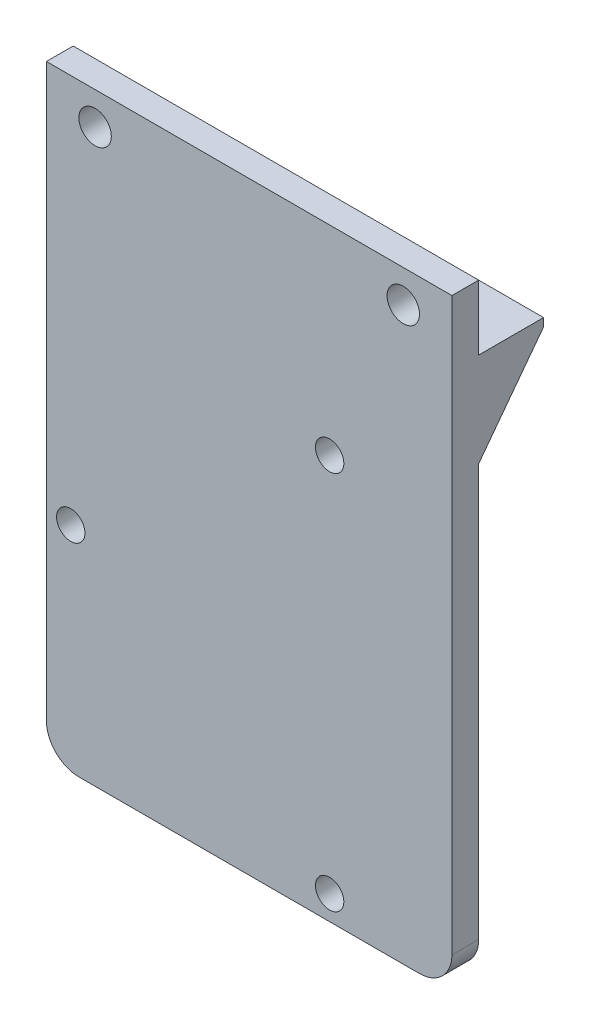
ISO-10303-21;
HEADER;
FILE_DESCRIPTION(('STEP AP214'),'2;1');
FILE_NAME('part.step','',(''),(''),'','','');
FILE_SCHEMA(('AUTOMOTIVE_DESIGN { 1 0 10303 214 1 1 1 1 }'));
ENDSEC;
DATA;
#1=APPLICATION_CONTEXT('core data for automotive mechanical design processes');
#2=APPLICATION_PROTOCOL_DEFINITION('international standard','automotive_design',2000,#1);
#3=PRODUCT_CONTEXT('',#1,'mechanical');
#4=PRODUCT('Part','Part','',(#3));
#5=PRODUCT_RELATED_PRODUCT_CATEGORY('part','',(#4));
#6=PRODUCT_DEFINITION_FORMATION('','',#4);
#7=PRODUCT_DEFINITION_CONTEXT('part definition',#1,'design');
#8=PRODUCT_DEFINITION('design','',#6,#7);
#9=PRODUCT_DEFINITION_SHAPE('','',#8);
#10=(LENGTH_UNIT() NAMED_UNIT(*) SI_UNIT(.MILLI.,.METRE.));
#11=(NAMED_UNIT(*) PLANE_ANGLE_UNIT() SI_UNIT($,.RADIAN.));
#12=(NAMED_UNIT(*) SI_UNIT($,.STERADIAN.) SOLID_ANGLE_UNIT());
#13=UNCERTAINTY_MEASURE_WITH_UNIT(LENGTH_MEASURE(1.E-05),#10,'distance_accuracy_value','');
#14=(GEOMETRIC_REPRESENTATION_CONTEXT(3) GLOBAL_UNCERTAINTY_ASSIGNED_CONTEXT((#13)) GLOBAL_UNIT_ASSIGNED_CONTEXT((#10,
#11,#12)) REPRESENTATION_CONTEXT('',''));
#15=CARTESIAN_POINT('',(0.,0.,0.));
#16=DIRECTION('',(0.,0.,1.));
#17=DIRECTION('',(1.,0.,0.));
#18=AXIS2_PLACEMENT_3D('',#15,#16,#17);
#19=CARTESIAN_POINT('',(0.,0.,0.));
#20=DIRECTION('',(0.,0.,1.));
#21=DIRECTION('',(1.,0.,0.));
#22=AXIS2_PLACEMENT_3D('',#19,#20,#21);
#23=PLANE('',#22);
#24=CARTESIAN_POINT('',(9.07999999999999,20.6,0.));
#25=DIRECTION('',(0.,0.,1.));
#26=DIRECTION('',(1.,0.,0.));
#27=AXIS2_PLACEMENT_3D('',#24,#25,#26);
#28=CIRCLE('',#27,2.);
#29=CARTESIAN_POINT('',(11.08,20.6,0.));
#30=VERTEX_POINT('',#29);
#31=EDGE_CURVE('E211',#30,#30,#28,.T.);
#32=ORIENTED_EDGE('',*,*,#31,.T.);
#33=EDGE_LOOP('',(#32));
#34=FACE_BOUND('',#33,.T.);
#35=CARTESIAN_POINT('',(-28.92,20.6,0.));
#36=DIRECTION('',(0.,0.,1.));
#37=DIRECTION('',(1.,0.,0.));
#38=AXIS2_PLACEMENT_3D('',#35,#36,#37);
#39=CIRCLE('',#38,2.);
#40=CARTESIAN_POINT('',(-26.92,20.6,0.));
#41=VERTEX_POINT('',#40);
#42=EDGE_CURVE('E170',#41,#41,#39,.T.);
#43=ORIENTED_EDGE('',*,*,#42,.T.);
#44=EDGE_LOOP('',(#43));
#45=FACE_BOUND('',#44,.T.);
#46=DIRECTION('',(1.,0.,0.));
#47=VECTOR('',#46,1.);
#48=CARTESIAN_POINT('',(-49.0111319630468,16.6,0.));
#49=LINE('',#48,#47);
#50=CARTESIAN_POINT('',(-34.92,16.6,0.));
#51=VERTEX_POINT('',#50);
#52=CARTESIAN_POINT('',(15.08,16.6,0.));
#53=VERTEX_POINT('',#52);
#54=EDGE_CURVE('E71',#51,#53,#49,.T.);
#55=ORIENTED_EDGE('',*,*,#54,.F.);
#56=DIRECTION('',(0.,-1.,0.));
#57=VECTOR('',#56,1.);
#58=CARTESIAN_POINT('',(-34.92,0.,0.));
#59=LINE('',#58,#57);
#60=CARTESIAN_POINT('',(-34.92,24.6,0.));
#61=VERTEX_POINT('',#60);
#62=EDGE_CURVE('E231',#61,#51,#59,.T.);
#63=ORIENTED_EDGE('',*,*,#62,.F.);
#64=DIRECTION('',(-1.,0.,0.));
#65=VECTOR('',#64,1.);
#66=CARTESIAN_POINT('',(0.,24.6,0.));
#67=LINE('',#66,#65);
#68=CARTESIAN_POINT('',(15.08,24.6,0.));
#69=VERTEX_POINT('',#68);
#70=EDGE_CURVE('E227',#69,#61,#67,.T.);
#71=ORIENTED_EDGE('',*,*,#70,.F.);
#72=DIRECTION('',(0.,-1.,0.));
#73=VECTOR('',#72,1.);
#74=CARTESIAN_POINT('',(15.08,0.,0.));
#75=LINE('',#74,#73);
#76=EDGE_CURVE('E176',#69,#53,#75,.T.);
#77=ORIENTED_EDGE('',*,*,#76,.T.);
#78=EDGE_LOOP('',(#55,#63,#71,#77));
#79=FACE_BOUND('',#78,.T.);
#80=ADVANCED_FACE('F47',(#34,#45,#79),#23,.F.);
#81=CARTESIAN_POINT('',(0.,24.6,3.3));
#82=DIRECTION('',(0.,-1.,0.));
#83=DIRECTION('',(1.,0.,0.));
#84=AXIS2_PLACEMENT_3D('',#81,#82,#83);
#85=PLANE('',#84);
#86=ORIENTED_EDGE('',*,*,#70,.T.);
#87=DIRECTION('',(0.,0.,-1.));
#88=VECTOR('',#87,1.);
#89=CARTESIAN_POINT('',(-34.92,24.6,3.3));
#90=LINE('',#89,#88);
#91=CARTESIAN_POINT('',(-34.92,24.6,3.3));
#92=VERTEX_POINT('',#91);
#93=EDGE_CURVE('E242',#92,#61,#90,.T.);
#94=ORIENTED_EDGE('',*,*,#93,.F.);
#95=DIRECTION('',(-1.,0.,0.));
#96=VECTOR('',#95,1.);
#97=CARTESIAN_POINT('',(0.,24.6,3.3));
#98=LINE('',#97,#96);
#99=CARTESIAN_POINT('',(15.08,24.6,3.3));
#100=VERTEX_POINT('',#99);
#101=EDGE_CURVE('E192',#100,#92,#98,.T.);
#102=ORIENTED_EDGE('',*,*,#101,.F.);
#103=DIRECTION('',(0.,0.,-1.));
#104=VECTOR('',#103,1.);
#105=CARTESIAN_POINT('',(15.08,24.6,3.3));
#106=LINE('',#105,#104);
#107=EDGE_CURVE('E207',#100,#69,#106,.T.);
#108=ORIENTED_EDGE('',*,*,#107,.T.);
#109=EDGE_LOOP('',(#86,#94,#102,#108));
#110=FACE_BOUND('',#109,.T.);
#111=ADVANCED_FACE('F289',(#110),#85,.F.);
#112=CARTESIAN_POINT('',(-34.92,0.,3.3));
#113=DIRECTION('',(1.,0.,0.));
#114=DIRECTION('',(0.,1.,0.));
#115=AXIS2_PLACEMENT_3D('',#112,#113,#114);
#116=PLANE('',#115);
#117=ORIENTED_EDGE('',*,*,#62,.T.);
#118=DIRECTION('',(0.,0.,-1.));
#119=VECTOR('',#118,1.);
#120=CARTESIAN_POINT('',(-34.92,16.6,0.));
#121=LINE('',#120,#119);
#122=CARTESIAN_POINT('',(-34.92,16.6,-8.));
#123=VERTEX_POINT('',#122);
#124=EDGE_CURVE('E156',#51,#123,#121,.T.);
#125=ORIENTED_EDGE('',*,*,#124,.T.);
#126=DIRECTION('',(0.,-1.,0.));
#127=VECTOR('',#126,1.);
#128=CARTESIAN_POINT('',(-34.92,16.6,-8.));
#129=LINE('',#128,#127);
#130=CARTESIAN_POINT('',(-34.92,15.6,-8.));
#131=VERTEX_POINT('',#130);
#132=EDGE_CURVE('E163',#123,#131,#129,.T.);
#133=ORIENTED_EDGE('',*,*,#132,.T.);
#134=DIRECTION('',(0.,-0.798189150333231,0.602406905911872));
#135=VECTOR('',#134,1.);
#136=CARTESIAN_POINT('',(-34.92,15.6,-8.));
#137=LINE('',#136,#135);
#138=CARTESIAN_POINT('',(-34.92,5.,0.));
#139=VERTEX_POINT('',#138);
#140=EDGE_CURVE('E131',#131,#139,#137,.T.);
#141=ORIENTED_EDGE('',*,*,#140,.T.);
#142=CARTESIAN_POINT('',(-34.92,-45.8,0.));
#143=VERTEX_POINT('',#142);
#144=EDGE_CURVE('E63',#139,#143,#59,.T.);
#145=ORIENTED_EDGE('',*,*,#144,.T.);
#146=DIRECTION('',(0.,0.,-1.));
#147=VECTOR('',#146,1.);
#148=CARTESIAN_POINT('',(-34.92,-45.8,3.3));
#149=LINE('',#148,#147);
#150=CARTESIAN_POINT('',(-34.92,-45.8,3.3));
#151=VERTEX_POINT('',#150);
#152=EDGE_CURVE('E11',#143,#151,#149,.F.);
#153=ORIENTED_EDGE('',*,*,#152,.T.);
#154=DIRECTION('',(0.,-1.,0.));
#155=VECTOR('',#154,1.);
#156=CARTESIAN_POINT('',(-34.92,0.,3.3));
#157=LINE('',#156,#155);
#158=EDGE_CURVE('E196',#92,#151,#157,.T.);
#159=ORIENTED_EDGE('',*,*,#158,.F.);
#160=ORIENTED_EDGE('',*,*,#93,.T.);
#161=EDGE_LOOP('',(#117,#125,#133,#141,#145,#153,#159,#160));
#162=FACE_BOUND('',#161,.T.);
#163=ADVANCED_FACE('F286',(#162),#116,.F.);
#164=CARTESIAN_POINT('',(0.,-49.8,3.3));
#165=DIRECTION('',(0.,-1.,0.));
#166=DIRECTION('',(1.,0.,0.));
#167=AXIS2_PLACEMENT_3D('',#164,#165,#166);
#168=PLANE('',#167);
#169=DIRECTION('',(-1.,0.,0.));
#170=VECTOR('',#169,1.);
#171=CARTESIAN_POINT('',(0.,-49.8,0.));
#172=LINE('',#171,#170);
#173=CARTESIAN_POINT('',(11.08,-49.8,0.));
#174=VERTEX_POINT('',#173);
#175=CARTESIAN_POINT('',(-30.92,-49.8,0.));
#176=VERTEX_POINT('',#175);
#177=EDGE_CURVE('E234',#174,#176,#172,.T.);
#178=ORIENTED_EDGE('',*,*,#177,.F.);
#179=DIRECTION('',(0.,0.,-1.));
#180=VECTOR('',#179,1.);
#181=CARTESIAN_POINT('',(11.08,-49.8,3.3));
#182=LINE('',#181,#180);
#183=CARTESIAN_POINT('',(11.08,-49.8,3.3));
#184=VERTEX_POINT('',#183);
#185=EDGE_CURVE('E259',#174,#184,#182,.F.);
#186=ORIENTED_EDGE('',*,*,#185,.T.);
#187=DIRECTION('',(-1.,0.,0.));
#188=VECTOR('',#187,1.);
#189=CARTESIAN_POINT('',(0.,-49.8,3.3));
#190=LINE('',#189,#188);
#191=CARTESIAN_POINT('',(-30.92,-49.8,3.3));
#192=VERTEX_POINT('',#191);
#193=EDGE_CURVE('E200',#184,#192,#190,.T.);
#194=ORIENTED_EDGE('',*,*,#193,.T.);
#195=DIRECTION('',(0.,0.,-1.));
#196=VECTOR('',#195,1.);
#197=CARTESIAN_POINT('',(-30.92,-49.8,0.));
#198=LINE('',#197,#196);
#199=EDGE_CURVE('E255',#192,#176,#198,.T.);
#200=ORIENTED_EDGE('',*,*,#199,.T.);
#201=EDGE_LOOP('',(#178,#186,#194,#200));
#202=FACE_BOUND('',#201,.T.);
#203=ADVANCED_FACE('F280',(#202),#168,.T.);
#204=CARTESIAN_POINT('',(0.,0.,3.3));
#205=DIRECTION('',(0.,0.,-1.));
#206=DIRECTION('',(-1.,0.,0.));
#207=AXIS2_PLACEMENT_3D('',#204,#205,#206);
#208=CYLINDRICAL_SURFACE('',#207,1.75);
#209=CARTESIAN_POINT('',(0.,0.,3.3));
#210=DIRECTION('',(0.,0.,1.));
#211=DIRECTION('',(1.,0.,0.));
#212=AXIS2_PLACEMENT_3D('',#209,#210,#211);
#213=CIRCLE('',#212,1.75);
#214=CARTESIAN_POINT('',(1.75,0.,3.3));
#215=VERTEX_POINT('',#214);
#216=EDGE_CURVE('E188',#215,#215,#213,.T.);
#217=ORIENTED_EDGE('',*,*,#216,.T.);
#218=EDGE_LOOP('',(#217));
#219=FACE_BOUND('',#218,.T.);
#220=CARTESIAN_POINT('',(0.,0.,0.));
#221=DIRECTION('',(0.,0.,1.));
#222=DIRECTION('',(1.,0.,0.));
#223=AXIS2_PLACEMENT_3D('',#220,#221,#222);
#224=CIRCLE('',#223,1.75);
#225=CARTESIAN_POINT('',(1.75,0.,0.));
#226=VERTEX_POINT('',#225);
#227=EDGE_CURVE('E223',#226,#226,#224,.T.);
#228=ORIENTED_EDGE('',*,*,#227,.F.);
#229=EDGE_LOOP('',(#228));
#230=FACE_BOUND('',#229,.T.);
#231=ADVANCED_FACE('F325',(#219,#230),#208,.F.);
#232=CARTESIAN_POINT('',(0.,-46.8,3.3));
#233=DIRECTION('',(0.,0.,-1.));
#234=DIRECTION('',(-1.,0.,0.));
#235=AXIS2_PLACEMENT_3D('',#232,#233,#234);
#236=CYLINDRICAL_SURFACE('',#235,1.75);
#237=CARTESIAN_POINT('',(0.,-46.8,3.3));
#238=DIRECTION('',(0.,0.,1.));
#239=DIRECTION('',(1.,0.,0.));
#240=AXIS2_PLACEMENT_3D('',#237,#238,#239);
#241=CIRCLE('',#240,1.75);
#242=CARTESIAN_POINT('',(1.75000000000001,-46.8,3.3));
#243=VERTEX_POINT('',#242);
#244=EDGE_CURVE('E184',#243,#243,#241,.T.);
#245=ORIENTED_EDGE('',*,*,#244,.T.);
#246=EDGE_LOOP('',(#245));
#247=FACE_BOUND('',#246,.T.);
#248=CARTESIAN_POINT('',(0.,-46.8,0.));
#249=DIRECTION('',(0.,0.,1.));
#250=DIRECTION('',(1.,0.,0.));
#251=AXIS2_PLACEMENT_3D('',#248,#249,#250);
#252=CIRCLE('',#251,1.75);
#253=CARTESIAN_POINT('',(1.75000000000001,-46.8,0.));
#254=VERTEX_POINT('',#253);
#255=EDGE_CURVE('E219',#254,#254,#252,.T.);
#256=ORIENTED_EDGE('',*,*,#255,.F.);
#257=EDGE_LOOP('',(#256));
#258=FACE_BOUND('',#257,.T.);
#259=ADVANCED_FACE('F327',(#247,#258),#236,.F.);
#260=CARTESIAN_POINT('',(-31.92,-23.4,3.3));
#261=DIRECTION('',(0.,0.,-1.));
#262=DIRECTION('',(-1.,0.,0.));
#263=AXIS2_PLACEMENT_3D('',#260,#261,#262);
#264=CYLINDRICAL_SURFACE('',#263,1.75);
#265=CARTESIAN_POINT('',(-31.92,-23.4,3.3));
#266=DIRECTION('',(0.,0.,1.));
#267=DIRECTION('',(1.,0.,0.));
#268=AXIS2_PLACEMENT_3D('',#265,#266,#267);
#269=CIRCLE('',#268,1.75);
#270=CARTESIAN_POINT('',(-30.17,-23.4,3.3));
#271=VERTEX_POINT('',#270);
#272=EDGE_CURVE('E180',#271,#271,#269,.T.);
#273=ORIENTED_EDGE('',*,*,#272,.T.);
#274=EDGE_LOOP('',(#273));
#275=FACE_BOUND('',#274,.T.);
#276=CARTESIAN_POINT('',(-31.92,-23.4,0.));
#277=DIRECTION('',(0.,0.,1.));
#278=DIRECTION('',(1.,0.,0.));
#279=AXIS2_PLACEMENT_3D('',#276,#277,#278);
#280=CIRCLE('',#279,1.75);
#281=CARTESIAN_POINT('',(-30.17,-23.4,0.));
#282=VERTEX_POINT('',#281);
#283=EDGE_CURVE('E215',#282,#282,#280,.T.);
#284=ORIENTED_EDGE('',*,*,#283,.F.);
#285=EDGE_LOOP('',(#284));
#286=FACE_BOUND('',#285,.T.);
#287=ADVANCED_FACE('F333',(#275,#286),#264,.F.);
#288=CARTESIAN_POINT('',(9.07999999999999,20.6,3.3));
#289=DIRECTION('',(0.,0.,-1.));
#290=DIRECTION('',(-1.,0.,0.));
#291=AXIS2_PLACEMENT_3D('',#288,#289,#290);
#292=CYLINDRICAL_SURFACE('',#291,2.);
#293=CARTESIAN_POINT('',(9.07999999999999,20.6,3.3));
#294=DIRECTION('',(0.,0.,1.));
#295=DIRECTION('',(1.,0.,0.));
#296=AXIS2_PLACEMENT_3D('',#293,#294,#295);
#297=CIRCLE('',#296,2.);
#298=CARTESIAN_POINT('',(11.08,20.6,3.3));
#299=VERTEX_POINT('',#298);
#300=EDGE_CURVE('E175',#299,#299,#297,.T.);
#301=ORIENTED_EDGE('',*,*,#300,.T.);
#302=EDGE_LOOP('',(#301));
#303=FACE_BOUND('',#302,.T.);
#304=ORIENTED_EDGE('',*,*,#31,.F.);
#305=EDGE_LOOP('',(#304));
#306=FACE_BOUND('',#305,.T.);
#307=ADVANCED_FACE('F342',(#303,#306),#292,.F.);
#308=CARTESIAN_POINT('',(-28.92,20.6,3.3));
#309=DIRECTION('',(0.,0.,-1.));
#310=DIRECTION('',(-1.,0.,0.));
#311=AXIS2_PLACEMENT_3D('',#308,#309,#310);
#312=CYLINDRICAL_SURFACE('',#311,2.);
#313=CARTESIAN_POINT('',(-28.92,20.6,3.3));
#314=DIRECTION('',(0.,0.,1.));
#315=DIRECTION('',(1.,0.,0.));
#316=AXIS2_PLACEMENT_3D('',#313,#314,#315);
#317=CIRCLE('',#316,2.);
#318=CARTESIAN_POINT('',(-26.92,20.6,3.3));
#319=VERTEX_POINT('',#318);
#320=EDGE_CURVE('E171',#319,#319,#317,.T.);
#321=ORIENTED_EDGE('',*,*,#320,.T.);
#322=EDGE_LOOP('',(#321));
#323=FACE_BOUND('',#322,.T.);
#324=ORIENTED_EDGE('',*,*,#42,.F.);
#325=EDGE_LOOP('',(#324));
#326=FACE_BOUND('',#325,.T.);
#327=ADVANCED_FACE('F346',(#323,#326),#312,.F.);
#328=CARTESIAN_POINT('',(15.08,0.,3.3));
#329=DIRECTION('',(1.,0.,0.));
#330=DIRECTION('',(0.,1.,0.));
#331=AXIS2_PLACEMENT_3D('',#328,#329,#330);
#332=PLANE('',#331);
#333=DIRECTION('',(0.,-1.,0.));
#334=VECTOR('',#333,1.);
#335=CARTESIAN_POINT('',(15.08,0.,3.3));
#336=LINE('',#335,#334);
#337=CARTESIAN_POINT('',(15.08,-45.8,3.3));
#338=VERTEX_POINT('',#337);
#339=EDGE_CURVE('E204',#100,#338,#336,.T.);
#340=ORIENTED_EDGE('',*,*,#339,.T.);
#341=DIRECTION('',(0.,0.,-1.));
#342=VECTOR('',#341,1.);
#343=CARTESIAN_POINT('',(15.08,-45.8,3.3));
#344=LINE('',#343,#342);
#345=CARTESIAN_POINT('',(15.08,-45.8,0.));
#346=VERTEX_POINT('',#345);
#347=EDGE_CURVE('E246',#338,#346,#344,.T.);
#348=ORIENTED_EDGE('',*,*,#347,.T.);
#349=CARTESIAN_POINT('',(15.08,5.,0.));
#350=VERTEX_POINT('',#349);
#351=EDGE_CURVE('E152',#350,#346,#75,.T.);
#352=ORIENTED_EDGE('',*,*,#351,.F.);
#353=DIRECTION('',(0.,0.798189150333231,-0.602406905911872));
#354=VECTOR('',#353,1.);
#355=CARTESIAN_POINT('',(15.08,15.6,-8.));
#356=LINE('',#355,#354);
#357=CARTESIAN_POINT('',(15.08,15.6,-8.));
#358=VERTEX_POINT('',#357);
#359=EDGE_CURVE('E130',#350,#358,#356,.T.);
#360=ORIENTED_EDGE('',*,*,#359,.T.);
#361=DIRECTION('',(0.,1.,0.));
#362=VECTOR('',#361,1.);
#363=CARTESIAN_POINT('',(15.08,16.6,-8.));
#364=LINE('',#363,#362);
#365=CARTESIAN_POINT('',(15.08,16.6,-8.));
#366=VERTEX_POINT('',#365);
#367=EDGE_CURVE('E139',#358,#366,#364,.T.);
#368=ORIENTED_EDGE('',*,*,#367,.T.);
#369=DIRECTION('',(0.,0.,1.));
#370=VECTOR('',#369,1.);
#371=CARTESIAN_POINT('',(15.08,16.6,0.));
#372=LINE('',#371,#370);
#373=EDGE_CURVE('E146',#366,#53,#372,.T.);
#374=ORIENTED_EDGE('',*,*,#373,.T.);
#375=ORIENTED_EDGE('',*,*,#76,.F.);
#376=ORIENTED_EDGE('',*,*,#107,.F.);
#377=EDGE_LOOP('',(#340,#348,#352,#360,#368,#374,#375,#376));
#378=FACE_BOUND('',#377,.T.);
#379=ADVANCED_FACE('F150',(#378),#332,.T.);
#380=CARTESIAN_POINT('',(0.,0.,3.3));
#381=DIRECTION('',(0.,0.,1.));
#382=DIRECTION('',(1.,0.,0.));
#383=AXIS2_PLACEMENT_3D('',#380,#381,#382);
#384=PLANE('',#383);
#385=ORIENTED_EDGE('',*,*,#320,.F.);
#386=EDGE_LOOP('',(#385));
#387=FACE_BOUND('',#386,.T.);
#388=ORIENTED_EDGE('',*,*,#300,.F.);
#389=EDGE_LOOP('',(#388));
#390=FACE_BOUND('',#389,.T.);
#391=ORIENTED_EDGE('',*,*,#272,.F.);
#392=EDGE_LOOP('',(#391));
#393=FACE_BOUND('',#392,.T.);
#394=ORIENTED_EDGE('',*,*,#244,.F.);
#395=EDGE_LOOP('',(#394));
#396=FACE_BOUND('',#395,.T.);
#397=ORIENTED_EDGE('',*,*,#216,.F.);
#398=EDGE_LOOP('',(#397));
#399=FACE_BOUND('',#398,.T.);
#400=ORIENTED_EDGE('',*,*,#193,.F.);
#401=CARTESIAN_POINT('',(11.08,-45.8,3.3));
#402=DIRECTION('',(0.,0.,1.));
#403=DIRECTION('',(1.,0.,0.));
#404=AXIS2_PLACEMENT_3D('',#401,#402,#403);
#405=CIRCLE('',#404,4.);
#406=EDGE_CURVE('E56',#184,#338,#405,.T.);
#407=ORIENTED_EDGE('',*,*,#406,.T.);
#408=ORIENTED_EDGE('',*,*,#339,.F.);
#409=ORIENTED_EDGE('',*,*,#101,.T.);
#410=ORIENTED_EDGE('',*,*,#158,.T.);
#411=CARTESIAN_POINT('',(-30.92,-45.8,3.3));
#412=DIRECTION('',(0.,0.,1.));
#413=DIRECTION('',(1.,0.,0.));
#414=AXIS2_PLACEMENT_3D('',#411,#412,#413);
#415=CIRCLE('',#414,4.);
#416=EDGE_CURVE('E262',#151,#192,#415,.T.);
#417=ORIENTED_EDGE('',*,*,#416,.T.);
#418=EDGE_LOOP('',(#400,#407,#408,#409,#410,#417));
#419=FACE_BOUND('',#418,.T.);
#420=ADVANCED_FACE('F269',(#387,#390,#393,#396,#399,#419),#384,.T.);
#421=ORIENTED_EDGE('',*,*,#283,.T.);
#422=EDGE_LOOP('',(#421));
#423=FACE_BOUND('',#422,.T.);
#424=ORIENTED_EDGE('',*,*,#255,.T.);
#425=EDGE_LOOP('',(#424));
#426=FACE_BOUND('',#425,.T.);
#427=ORIENTED_EDGE('',*,*,#227,.T.);
#428=EDGE_LOOP('',(#427));
#429=FACE_BOUND('',#428,.T.);
#430=ORIENTED_EDGE('',*,*,#144,.F.);
#431=DIRECTION('',(1.,0.,0.));
#432=VECTOR('',#431,1.);
#433=CARTESIAN_POINT('',(-49.0111319630468,4.99999999999999,0.));
#434=LINE('',#433,#432);
#435=EDGE_CURVE('E136',#139,#350,#434,.T.);
#436=ORIENTED_EDGE('',*,*,#435,.T.);
#437=ORIENTED_EDGE('',*,*,#351,.T.);
#438=CARTESIAN_POINT('',(11.08,-45.8,0.));
#439=DIRECTION('',(0.,0.,1.));
#440=DIRECTION('',(1.,0.,0.));
#441=AXIS2_PLACEMENT_3D('',#438,#439,#440);
#442=CIRCLE('',#441,4.);
#443=EDGE_CURVE('E252',#346,#174,#442,.F.);
#444=ORIENTED_EDGE('',*,*,#443,.T.);
#445=ORIENTED_EDGE('',*,*,#177,.T.);
#446=CARTESIAN_POINT('',(-30.92,-45.8,0.));
#447=DIRECTION('',(0.,0.,1.));
#448=DIRECTION('',(1.,0.,0.));
#449=AXIS2_PLACEMENT_3D('',#446,#447,#448);
#450=CIRCLE('',#449,4.);
#451=EDGE_CURVE('E249',#176,#143,#450,.F.);
#452=ORIENTED_EDGE('',*,*,#451,.T.);
#453=EDGE_LOOP('',(#430,#436,#437,#444,#445,#452));
#454=FACE_BOUND('',#453,.T.);
#455=ADVANCED_FACE('F278',(#423,#426,#429,#454),#23,.F.);
#456=CARTESIAN_POINT('',(11.08,-45.8,3.3));
#457=DIRECTION('',(0.,0.,-1.));
#458=DIRECTION('',(-1.,0.,0.));
#459=AXIS2_PLACEMENT_3D('',#456,#457,#458);
#460=CYLINDRICAL_SURFACE('',#459,4.);
#461=ORIENTED_EDGE('',*,*,#406,.F.);
#462=ORIENTED_EDGE('',*,*,#185,.F.);
#463=ORIENTED_EDGE('',*,*,#443,.F.);
#464=ORIENTED_EDGE('',*,*,#347,.F.);
#465=EDGE_LOOP('',(#461,#462,#463,#464));
#466=FACE_BOUND('',#465,.T.);
#467=ADVANCED_FACE('F276',(#466),#460,.T.);
#468=CARTESIAN_POINT('',(-30.92,-45.8,3.3));
#469=DIRECTION('',(0.,0.,1.));
#470=DIRECTION('',(1.,0.,0.));
#471=AXIS2_PLACEMENT_3D('',#468,#469,#470);
#472=CYLINDRICAL_SURFACE('',#471,4.);
#473=ORIENTED_EDGE('',*,*,#416,.F.);
#474=ORIENTED_EDGE('',*,*,#152,.F.);
#475=ORIENTED_EDGE('',*,*,#451,.F.);
#476=ORIENTED_EDGE('',*,*,#199,.F.);
#477=EDGE_LOOP('',(#473,#474,#475,#476));
#478=FACE_BOUND('',#477,.T.);
#479=ADVANCED_FACE('F49',(#478),#472,.T.);
#480=CARTESIAN_POINT('',(-49.0111319630468,16.6,0.));
#481=DIRECTION('',(0.,1.,0.));
#482=DIRECTION('',(-1.,0.,0.));
#483=AXIS2_PLACEMENT_3D('',#480,#481,#482);
#484=PLANE('',#483);
#485=ORIENTED_EDGE('',*,*,#124,.F.);
#486=ORIENTED_EDGE('',*,*,#54,.T.);
#487=ORIENTED_EDGE('',*,*,#373,.F.);
#488=DIRECTION('',(1.,0.,0.));
#489=VECTOR('',#488,1.);
#490=CARTESIAN_POINT('',(-49.0111319630468,16.6,-8.));
#491=LINE('',#490,#489);
#492=EDGE_CURVE('E135',#123,#366,#491,.T.);
#493=ORIENTED_EDGE('',*,*,#492,.F.);
#494=EDGE_LOOP('',(#485,#486,#487,#493));
#495=FACE_BOUND('',#494,.T.);
#496=ADVANCED_FACE('F293',(#495),#484,.T.);
#497=CARTESIAN_POINT('',(-49.0111319630468,16.6,-8.));
#498=DIRECTION('',(0.,0.,-1.));
#499=DIRECTION('',(-1.,0.,0.));
#500=AXIS2_PLACEMENT_3D('',#497,#498,#499);
#501=PLANE('',#500);
#502=ORIENTED_EDGE('',*,*,#132,.F.);
#503=ORIENTED_EDGE('',*,*,#492,.T.);
#504=ORIENTED_EDGE('',*,*,#367,.F.);
#505=DIRECTION('',(1.,0.,0.));
#506=VECTOR('',#505,1.);
#507=CARTESIAN_POINT('',(-49.0111319630468,15.6,-8.));
#508=LINE('',#507,#506);
#509=EDGE_CURVE('E125',#131,#358,#508,.T.);
#510=ORIENTED_EDGE('',*,*,#509,.F.);
#511=EDGE_LOOP('',(#502,#503,#504,#510));
#512=FACE_BOUND('',#511,.T.);
#513=ADVANCED_FACE('F140',(#512),#501,.T.);
#514=CARTESIAN_POINT('',(-49.0111319630468,15.6,-8.));
#515=DIRECTION('',(0.,-0.602406905911872,-0.798189150333231));
#516=DIRECTION('',(0.,0.798189150333231,-0.602406905911872));
#517=AXIS2_PLACEMENT_3D('',#514,#515,#516);
#518=PLANE('',#517);
#519=ORIENTED_EDGE('',*,*,#140,.F.);
#520=ORIENTED_EDGE('',*,*,#509,.T.);
#521=ORIENTED_EDGE('',*,*,#359,.F.);
#522=ORIENTED_EDGE('',*,*,#435,.F.);
#523=EDGE_LOOP('',(#519,#520,#521,#522));
#524=FACE_BOUND('',#523,.T.);
#525=ADVANCED_FACE('F127',(#524),#518,.T.);
#526=CLOSED_SHELL('',(#80,#111,#163,#203,#231,#259,#287,#307,#327,#379,#420,#455,#467,#479,#496,
#513,#525));
#527=MANIFOLD_SOLID_BREP('B2',#526);
#528=ADVANCED_BREP_SHAPE_REPRESENTATION('',(#18,#527),#14);
#529=SHAPE_DEFINITION_REPRESENTATION(#9,#528);
ENDSEC;
END-ISO-10303-21;
